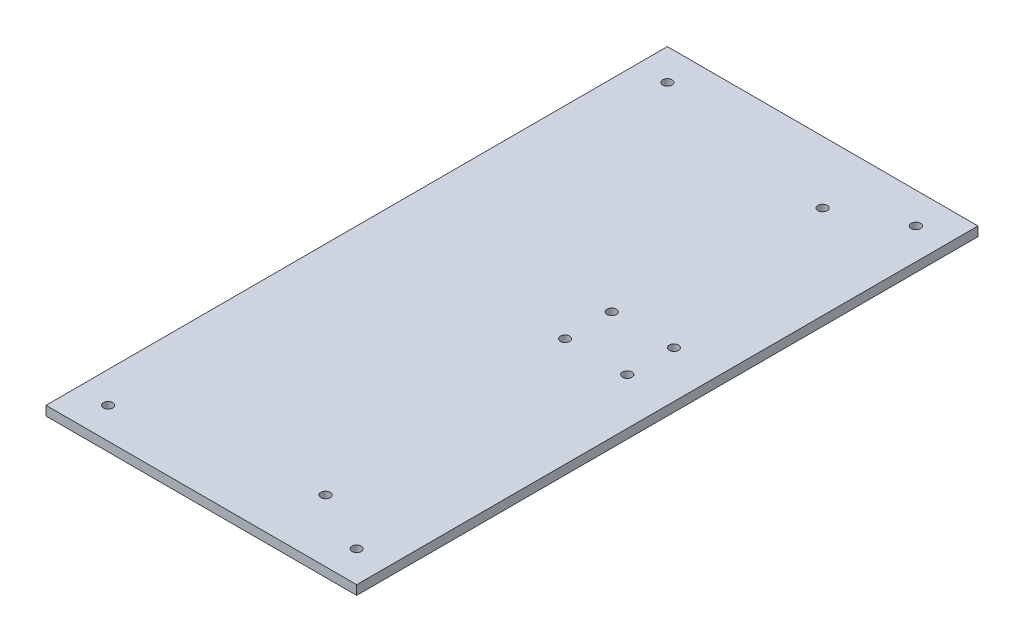
ISO-10303-21;
HEADER;
FILE_DESCRIPTION(('STEP AP214'),'2;1');
FILE_NAME('part.step','',(''),(''),'','','');
FILE_SCHEMA(('AUTOMOTIVE_DESIGN { 1 0 10303 214 1 1 1 1 }'));
ENDSEC;
DATA;
#1=APPLICATION_CONTEXT('core data for automotive mechanical design processes');
#2=APPLICATION_PROTOCOL_DEFINITION('international standard','automotive_design',2000,#1);
#3=PRODUCT_CONTEXT('',#1,'mechanical');
#4=PRODUCT('Part','Part','',(#3));
#5=PRODUCT_RELATED_PRODUCT_CATEGORY('part','',(#4));
#6=PRODUCT_DEFINITION_FORMATION('','',#4);
#7=PRODUCT_DEFINITION_CONTEXT('part definition',#1,'design');
#8=PRODUCT_DEFINITION('design','',#6,#7);
#9=PRODUCT_DEFINITION_SHAPE('','',#8);
#10=(LENGTH_UNIT() NAMED_UNIT(*) SI_UNIT(.MILLI.,.METRE.));
#11=(NAMED_UNIT(*) PLANE_ANGLE_UNIT() SI_UNIT($,.RADIAN.));
#12=(NAMED_UNIT(*) SI_UNIT($,.STERADIAN.) SOLID_ANGLE_UNIT());
#13=UNCERTAINTY_MEASURE_WITH_UNIT(LENGTH_MEASURE(1.E-05),#10,'distance_accuracy_value','');
#14=(GEOMETRIC_REPRESENTATION_CONTEXT(3) GLOBAL_UNCERTAINTY_ASSIGNED_CONTEXT((#13)) GLOBAL_UNIT_ASSIGNED_CONTEXT((#10,
#11,#12)) REPRESENTATION_CONTEXT('',''));
#15=CARTESIAN_POINT('',(0.,0.,0.));
#16=DIRECTION('',(0.,0.,1.));
#17=DIRECTION('',(1.,0.,0.));
#18=AXIS2_PLACEMENT_3D('',#15,#16,#17);
#19=CARTESIAN_POINT('',(-50.,3.,100.));
#20=DIRECTION('',(1.,0.,0.));
#21=DIRECTION('',(0.,0.,-1.));
#22=AXIS2_PLACEMENT_3D('',#19,#20,#21);
#23=PLANE('',#22);
#24=DIRECTION('',(0.,0.,1.));
#25=VECTOR('',#24,1.);
#26=CARTESIAN_POINT('',(-50.,0.,100.));
#27=LINE('',#26,#25);
#28=CARTESIAN_POINT('',(-50.,0.,-100.));
#29=VERTEX_POINT('',#28);
#30=CARTESIAN_POINT('',(-50.,0.,100.));
#31=VERTEX_POINT('',#30);
#32=EDGE_CURVE('E100',#29,#31,#27,.T.);
#33=ORIENTED_EDGE('',*,*,#32,.T.);
#34=DIRECTION('',(0.,-1.,0.));
#35=VECTOR('',#34,1.);
#36=CARTESIAN_POINT('',(-50.,3.,100.));
#37=LINE('',#36,#35);
#38=CARTESIAN_POINT('',(-50.,3.,100.));
#39=VERTEX_POINT('',#38);
#40=EDGE_CURVE('E11',#39,#31,#37,.T.);
#41=ORIENTED_EDGE('',*,*,#40,.F.);
#42=DIRECTION('',(0.,0.,1.));
#43=VECTOR('',#42,1.);
#44=CARTESIAN_POINT('',(-50.,3.,100.));
#45=LINE('',#44,#43);
#46=CARTESIAN_POINT('',(-50.,3.,-100.));
#47=VERTEX_POINT('',#46);
#48=EDGE_CURVE('E87',#47,#39,#45,.T.);
#49=ORIENTED_EDGE('',*,*,#48,.F.);
#50=DIRECTION('',(0.,-1.,0.));
#51=VECTOR('',#50,1.);
#52=CARTESIAN_POINT('',(-50.,3.,-100.));
#53=LINE('',#52,#51);
#54=EDGE_CURVE('E96',#47,#29,#53,.T.);
#55=ORIENTED_EDGE('',*,*,#54,.T.);
#56=EDGE_LOOP('',(#33,#41,#49,#55));
#57=FACE_BOUND('',#56,.T.);
#58=ADVANCED_FACE('F34',(#57),#23,.F.);
#59=CARTESIAN_POINT('',(50.,3.,100.));
#60=DIRECTION('',(0.,0.,-1.));
#61=DIRECTION('',(-1.,0.,0.));
#62=AXIS2_PLACEMENT_3D('',#59,#60,#61);
#63=PLANE('',#62);
#64=DIRECTION('',(1.,0.,0.));
#65=VECTOR('',#64,1.);
#66=CARTESIAN_POINT('',(50.,0.,100.));
#67=LINE('',#66,#65);
#68=CARTESIAN_POINT('',(50.,0.,100.));
#69=VERTEX_POINT('',#68);
#70=EDGE_CURVE('E91',#31,#69,#67,.T.);
#71=ORIENTED_EDGE('',*,*,#70,.T.);
#72=DIRECTION('',(0.,-1.,0.));
#73=VECTOR('',#72,1.);
#74=CARTESIAN_POINT('',(50.,3.,100.));
#75=LINE('',#74,#73);
#76=CARTESIAN_POINT('',(50.,3.,100.));
#77=VERTEX_POINT('',#76);
#78=EDGE_CURVE('E43',#77,#69,#75,.T.);
#79=ORIENTED_EDGE('',*,*,#78,.F.);
#80=DIRECTION('',(1.,0.,0.));
#81=VECTOR('',#80,1.);
#82=CARTESIAN_POINT('',(50.,3.,100.));
#83=LINE('',#82,#81);
#84=EDGE_CURVE('E82',#39,#77,#83,.T.);
#85=ORIENTED_EDGE('',*,*,#84,.F.);
#86=ORIENTED_EDGE('',*,*,#40,.T.);
#87=EDGE_LOOP('',(#71,#79,#85,#86));
#88=FACE_BOUND('',#87,.T.);
#89=ADVANCED_FACE('F90',(#88),#63,.F.);
#90=CARTESIAN_POINT('',(50.,3.,100.));
#91=DIRECTION('',(-1.,0.,0.));
#92=DIRECTION('',(0.,0.,1.));
#93=AXIS2_PLACEMENT_3D('',#90,#91,#92);
#94=PLANE('',#93);
#95=DIRECTION('',(0.,0.,-1.));
#96=VECTOR('',#95,1.);
#97=CARTESIAN_POINT('',(50.,0.,100.));
#98=LINE('',#97,#96);
#99=CARTESIAN_POINT('',(50.,0.,-100.));
#100=VERTEX_POINT('',#99);
#101=EDGE_CURVE('E69',#69,#100,#98,.T.);
#102=ORIENTED_EDGE('',*,*,#101,.T.);
#103=DIRECTION('',(0.,-1.,0.));
#104=VECTOR('',#103,1.);
#105=CARTESIAN_POINT('',(50.,3.,-100.));
#106=LINE('',#105,#104);
#107=CARTESIAN_POINT('',(50.,3.,-100.));
#108=VERTEX_POINT('',#107);
#109=EDGE_CURVE('E92',#108,#100,#106,.T.);
#110=ORIENTED_EDGE('',*,*,#109,.F.);
#111=DIRECTION('',(0.,0.,-1.));
#112=VECTOR('',#111,1.);
#113=CARTESIAN_POINT('',(50.,3.,100.));
#114=LINE('',#113,#112);
#115=EDGE_CURVE('E85',#77,#108,#114,.T.);
#116=ORIENTED_EDGE('',*,*,#115,.F.);
#117=ORIENTED_EDGE('',*,*,#78,.T.);
#118=EDGE_LOOP('',(#102,#110,#116,#117));
#119=FACE_BOUND('',#118,.T.);
#120=ADVANCED_FACE('F94',(#119),#94,.F.);
#121=CARTESIAN_POINT('',(50.,3.,-100.));
#122=DIRECTION('',(0.,0.,1.));
#123=DIRECTION('',(1.,0.,0.));
#124=AXIS2_PLACEMENT_3D('',#121,#122,#123);
#125=PLANE('',#124);
#126=DIRECTION('',(-1.,0.,0.));
#127=VECTOR('',#126,1.);
#128=CARTESIAN_POINT('',(50.,0.,-100.));
#129=LINE('',#128,#127);
#130=EDGE_CURVE('E75',#100,#29,#129,.T.);
#131=ORIENTED_EDGE('',*,*,#130,.T.);
#132=ORIENTED_EDGE('',*,*,#54,.F.);
#133=DIRECTION('',(-1.,0.,0.));
#134=VECTOR('',#133,1.);
#135=CARTESIAN_POINT('',(50.,3.,-100.));
#136=LINE('',#135,#134);
#137=EDGE_CURVE('E52',#108,#47,#136,.T.);
#138=ORIENTED_EDGE('',*,*,#137,.F.);
#139=ORIENTED_EDGE('',*,*,#109,.T.);
#140=EDGE_LOOP('',(#131,#132,#138,#139));
#141=FACE_BOUND('',#140,.T.);
#142=ADVANCED_FACE('F150',(#141),#125,.F.);
#143=CARTESIAN_POINT('',(0.,3.,0.));
#144=DIRECTION('',(0.,1.,0.));
#145=DIRECTION('',(0.,0.,1.));
#146=AXIS2_PLACEMENT_3D('',#143,#144,#145);
#147=PLANE('',#146);
#148=CARTESIAN_POINT('',(35.,3.,-2.09999999999999));
#149=DIRECTION('',(0.,1.,0.));
#150=DIRECTION('',(0.,0.,1.));
#151=AXIS2_PLACEMENT_3D('',#148,#149,#150);
#152=CIRCLE('',#151,1.5);
#153=CARTESIAN_POINT('',(35.,3.,-0.59999999999999));
#154=VERTEX_POINT('',#153);
#155=EDGE_CURVE('E296',#154,#154,#152,.T.);
#156=ORIENTED_EDGE('',*,*,#155,.F.);
#157=EDGE_LOOP('',(#156));
#158=FACE_BOUND('',#157,.T.);
#159=CARTESIAN_POINT('',(15.,3.,-17.1));
#160=DIRECTION('',(0.,1.,0.));
#161=DIRECTION('',(0.,0.,1.));
#162=AXIS2_PLACEMENT_3D('',#159,#160,#161);
#163=CIRCLE('',#162,1.5);
#164=CARTESIAN_POINT('',(15.,3.,-15.6));
#165=VERTEX_POINT('',#164);
#166=EDGE_CURVE('E298',#165,#165,#163,.T.);
#167=ORIENTED_EDGE('',*,*,#166,.F.);
#168=EDGE_LOOP('',(#167));
#169=FACE_BOUND('',#168,.T.);
#170=CARTESIAN_POINT('',(15.,3.,-2.09999999999999));
#171=DIRECTION('',(0.,1.,0.));
#172=DIRECTION('',(0.,0.,1.));
#173=AXIS2_PLACEMENT_3D('',#170,#171,#172);
#174=CIRCLE('',#173,1.5);
#175=CARTESIAN_POINT('',(15.,3.,-0.599999999999994));
#176=VERTEX_POINT('',#175);
#177=EDGE_CURVE('E304',#176,#176,#174,.T.);
#178=ORIENTED_EDGE('',*,*,#177,.F.);
#179=EDGE_LOOP('',(#178));
#180=FACE_BOUND('',#179,.T.);
#181=CARTESIAN_POINT('',(35.,3.,-17.1));
#182=DIRECTION('',(0.,1.,0.));
#183=DIRECTION('',(0.,0.,1.));
#184=AXIS2_PLACEMENT_3D('',#181,#182,#183);
#185=CIRCLE('',#184,1.5);
#186=CARTESIAN_POINT('',(35.,3.,-15.6));
#187=VERTEX_POINT('',#186);
#188=EDGE_CURVE('E310',#187,#187,#185,.T.);
#189=ORIENTED_EDGE('',*,*,#188,.F.);
#190=EDGE_LOOP('',(#189));
#191=FACE_BOUND('',#190,.T.);
#192=CARTESIAN_POINT('',(20.,3.,80.));
#193=DIRECTION('',(0.,1.,0.));
#194=DIRECTION('',(0.,0.,-1.));
#195=AXIS2_PLACEMENT_3D('',#192,#193,#194);
#196=CIRCLE('',#195,1.5);
#197=CARTESIAN_POINT('',(20.,3.,78.5));
#198=VERTEX_POINT('',#197);
#199=EDGE_CURVE('E122',#198,#198,#196,.T.);
#200=ORIENTED_EDGE('',*,*,#199,.F.);
#201=EDGE_LOOP('',(#200));
#202=FACE_BOUND('',#201,.T.);
#203=CARTESIAN_POINT('',(20.,3.,-80.));
#204=DIRECTION('',(0.,1.,0.));
#205=DIRECTION('',(0.,0.,1.));
#206=AXIS2_PLACEMENT_3D('',#203,#204,#205);
#207=CIRCLE('',#206,1.5);
#208=CARTESIAN_POINT('',(20.,3.,-78.5));
#209=VERTEX_POINT('',#208);
#210=EDGE_CURVE('E111',#209,#209,#207,.T.);
#211=ORIENTED_EDGE('',*,*,#210,.F.);
#212=EDGE_LOOP('',(#211));
#213=FACE_BOUND('',#212,.T.);
#214=CARTESIAN_POINT('',(-40.,3.,-90.));
#215=DIRECTION('',(0.,1.,0.));
#216=DIRECTION('',(0.,0.,-1.));
#217=AXIS2_PLACEMENT_3D('',#214,#215,#216);
#218=CIRCLE('',#217,1.5);
#219=CARTESIAN_POINT('',(-40.,3.,-91.5));
#220=VERTEX_POINT('',#219);
#221=EDGE_CURVE('E110',#220,#220,#218,.T.);
#222=ORIENTED_EDGE('',*,*,#221,.F.);
#223=EDGE_LOOP('',(#222));
#224=FACE_BOUND('',#223,.T.);
#225=CARTESIAN_POINT('',(40.,3.,-90.));
#226=DIRECTION('',(0.,1.,0.));
#227=DIRECTION('',(0.,0.,1.));
#228=AXIS2_PLACEMENT_3D('',#225,#226,#227);
#229=CIRCLE('',#228,1.5);
#230=CARTESIAN_POINT('',(40.,3.,-88.5));
#231=VERTEX_POINT('',#230);
#232=EDGE_CURVE('E127',#231,#231,#229,.T.);
#233=ORIENTED_EDGE('',*,*,#232,.F.);
#234=EDGE_LOOP('',(#233));
#235=FACE_BOUND('',#234,.T.);
#236=CARTESIAN_POINT('',(40.,3.,90.));
#237=DIRECTION('',(0.,1.,0.));
#238=DIRECTION('',(0.,0.,-1.));
#239=AXIS2_PLACEMENT_3D('',#236,#237,#238);
#240=CIRCLE('',#239,1.5);
#241=CARTESIAN_POINT('',(40.,3.,88.5));
#242=VERTEX_POINT('',#241);
#243=EDGE_CURVE('E132',#242,#242,#240,.T.);
#244=ORIENTED_EDGE('',*,*,#243,.F.);
#245=EDGE_LOOP('',(#244));
#246=FACE_BOUND('',#245,.T.);
#247=CARTESIAN_POINT('',(-40.,3.,90.));
#248=DIRECTION('',(0.,1.,0.));
#249=DIRECTION('',(0.,0.,1.));
#250=AXIS2_PLACEMENT_3D('',#247,#248,#249);
#251=CIRCLE('',#250,1.5);
#252=CARTESIAN_POINT('',(-40.,3.,91.5));
#253=VERTEX_POINT('',#252);
#254=EDGE_CURVE('E138',#253,#253,#251,.T.);
#255=ORIENTED_EDGE('',*,*,#254,.F.);
#256=EDGE_LOOP('',(#255));
#257=FACE_BOUND('',#256,.T.);
#258=ORIENTED_EDGE('',*,*,#48,.T.);
#259=ORIENTED_EDGE('',*,*,#84,.T.);
#260=ORIENTED_EDGE('',*,*,#115,.T.);
#261=ORIENTED_EDGE('',*,*,#137,.T.);
#262=EDGE_LOOP('',(#258,#259,#260,#261));
#263=FACE_BOUND('',#262,.T.);
#264=ADVANCED_FACE('F83',(#158,#169,#180,#191,#202,#213,#224,#235,#246,#257,#263),#147,.T.);
#265=CARTESIAN_POINT('',(0.,0.,0.));
#266=DIRECTION('',(0.,1.,0.));
#267=DIRECTION('',(0.,0.,1.));
#268=AXIS2_PLACEMENT_3D('',#265,#266,#267);
#269=PLANE('',#268);
#270=CARTESIAN_POINT('',(35.,0.,-2.09999999999999));
#271=DIRECTION('',(0.,1.,0.));
#272=DIRECTION('',(0.,0.,1.));
#273=AXIS2_PLACEMENT_3D('',#270,#271,#272);
#274=CIRCLE('',#273,1.5);
#275=CARTESIAN_POINT('',(35.,0.,-0.59999999999999));
#276=VERTEX_POINT('',#275);
#277=EDGE_CURVE('E294',#276,#276,#274,.T.);
#278=ORIENTED_EDGE('',*,*,#277,.T.);
#279=EDGE_LOOP('',(#278));
#280=FACE_BOUND('',#279,.T.);
#281=CARTESIAN_POINT('',(15.,0.,-17.1));
#282=DIRECTION('',(0.,1.,0.));
#283=DIRECTION('',(0.,0.,1.));
#284=AXIS2_PLACEMENT_3D('',#281,#282,#283);
#285=CIRCLE('',#284,1.5);
#286=CARTESIAN_POINT('',(15.,0.,-15.6));
#287=VERTEX_POINT('',#286);
#288=EDGE_CURVE('E301',#287,#287,#285,.T.);
#289=ORIENTED_EDGE('',*,*,#288,.T.);
#290=EDGE_LOOP('',(#289));
#291=FACE_BOUND('',#290,.T.);
#292=CARTESIAN_POINT('',(15.,0.,-2.09999999999999));
#293=DIRECTION('',(0.,1.,0.));
#294=DIRECTION('',(0.,0.,1.));
#295=AXIS2_PLACEMENT_3D('',#292,#293,#294);
#296=CIRCLE('',#295,1.5);
#297=CARTESIAN_POINT('',(15.,0.,-0.599999999999994));
#298=VERTEX_POINT('',#297);
#299=EDGE_CURVE('E307',#298,#298,#296,.T.);
#300=ORIENTED_EDGE('',*,*,#299,.T.);
#301=EDGE_LOOP('',(#300));
#302=FACE_BOUND('',#301,.T.);
#303=CARTESIAN_POINT('',(35.,0.,-17.1));
#304=DIRECTION('',(0.,1.,0.));
#305=DIRECTION('',(0.,0.,1.));
#306=AXIS2_PLACEMENT_3D('',#303,#304,#305);
#307=CIRCLE('',#306,1.5);
#308=CARTESIAN_POINT('',(35.,0.,-15.6));
#309=VERTEX_POINT('',#308);
#310=EDGE_CURVE('E313',#309,#309,#307,.T.);
#311=ORIENTED_EDGE('',*,*,#310,.T.);
#312=EDGE_LOOP('',(#311));
#313=FACE_BOUND('',#312,.T.);
#314=CARTESIAN_POINT('',(20.,0.,80.));
#315=DIRECTION('',(0.,1.,0.));
#316=DIRECTION('',(0.,0.,1.));
#317=AXIS2_PLACEMENT_3D('',#314,#315,#316);
#318=CIRCLE('',#317,1.5);
#319=CARTESIAN_POINT('',(20.,0.,81.5));
#320=VERTEX_POINT('',#319);
#321=EDGE_CURVE('E37',#320,#320,#318,.T.);
#322=ORIENTED_EDGE('',*,*,#321,.T.);
#323=EDGE_LOOP('',(#322));
#324=FACE_BOUND('',#323,.T.);
#325=CARTESIAN_POINT('',(20.,0.,-80.));
#326=DIRECTION('',(0.,1.,0.));
#327=DIRECTION('',(0.,0.,1.));
#328=AXIS2_PLACEMENT_3D('',#325,#326,#327);
#329=CIRCLE('',#328,1.5);
#330=CARTESIAN_POINT('',(20.,0.,-78.5));
#331=VERTEX_POINT('',#330);
#332=EDGE_CURVE('E108',#331,#331,#329,.T.);
#333=ORIENTED_EDGE('',*,*,#332,.T.);
#334=EDGE_LOOP('',(#333));
#335=FACE_BOUND('',#334,.T.);
#336=CARTESIAN_POINT('',(-40.,0.,-90.));
#337=DIRECTION('',(0.,1.,0.));
#338=DIRECTION('',(0.,0.,-1.));
#339=AXIS2_PLACEMENT_3D('',#336,#337,#338);
#340=CIRCLE('',#339,1.5);
#341=CARTESIAN_POINT('',(-40.,0.,-91.5));
#342=VERTEX_POINT('',#341);
#343=EDGE_CURVE('E115',#342,#342,#340,.T.);
#344=ORIENTED_EDGE('',*,*,#343,.T.);
#345=EDGE_LOOP('',(#344));
#346=FACE_BOUND('',#345,.T.);
#347=CARTESIAN_POINT('',(40.,0.,-90.));
#348=DIRECTION('',(0.,1.,0.));
#349=DIRECTION('',(0.,0.,1.));
#350=AXIS2_PLACEMENT_3D('',#347,#348,#349);
#351=CIRCLE('',#350,1.5);
#352=CARTESIAN_POINT('',(40.,0.,-88.5));
#353=VERTEX_POINT('',#352);
#354=EDGE_CURVE('E129',#353,#353,#351,.T.);
#355=ORIENTED_EDGE('',*,*,#354,.T.);
#356=EDGE_LOOP('',(#355));
#357=FACE_BOUND('',#356,.T.);
#358=CARTESIAN_POINT('',(40.,0.,90.));
#359=DIRECTION('',(0.,1.,0.));
#360=DIRECTION('',(0.,0.,-1.));
#361=AXIS2_PLACEMENT_3D('',#358,#359,#360);
#362=CIRCLE('',#361,1.5);
#363=CARTESIAN_POINT('',(40.,0.,88.5));
#364=VERTEX_POINT('',#363);
#365=EDGE_CURVE('E135',#364,#364,#362,.T.);
#366=ORIENTED_EDGE('',*,*,#365,.T.);
#367=EDGE_LOOP('',(#366));
#368=FACE_BOUND('',#367,.T.);
#369=CARTESIAN_POINT('',(-40.,0.,90.));
#370=DIRECTION('',(0.,1.,0.));
#371=DIRECTION('',(0.,0.,1.));
#372=AXIS2_PLACEMENT_3D('',#369,#370,#371);
#373=CIRCLE('',#372,1.5);
#374=CARTESIAN_POINT('',(-40.,0.,91.5));
#375=VERTEX_POINT('',#374);
#376=EDGE_CURVE('E103',#375,#375,#373,.T.);
#377=ORIENTED_EDGE('',*,*,#376,.T.);
#378=EDGE_LOOP('',(#377));
#379=FACE_BOUND('',#378,.T.);
#380=ORIENTED_EDGE('',*,*,#32,.F.);
#381=ORIENTED_EDGE('',*,*,#130,.F.);
#382=ORIENTED_EDGE('',*,*,#101,.F.);
#383=ORIENTED_EDGE('',*,*,#70,.F.);
#384=EDGE_LOOP('',(#380,#381,#382,#383));
#385=FACE_BOUND('',#384,.T.);
#386=ADVANCED_FACE('F149',(#280,#291,#302,#313,#324,#335,#346,#357,#368,#379,#385),#269,.F.);
#387=CARTESIAN_POINT('',(-40.,0.,90.));
#388=DIRECTION('',(0.,1.,0.));
#389=DIRECTION('',(0.,0.,1.));
#390=AXIS2_PLACEMENT_3D('',#387,#388,#389);
#391=CYLINDRICAL_SURFACE('',#390,1.5);
#392=ORIENTED_EDGE('',*,*,#376,.F.);
#393=EDGE_LOOP('',(#392));
#394=FACE_BOUND('',#393,.T.);
#395=ORIENTED_EDGE('',*,*,#254,.T.);
#396=EDGE_LOOP('',(#395));
#397=FACE_BOUND('',#396,.T.);
#398=ADVANCED_FACE('F146',(#394,#397),#391,.F.);
#399=CARTESIAN_POINT('',(40.,0.,90.));
#400=DIRECTION('',(0.,1.,0.));
#401=DIRECTION('',(0.,0.,1.));
#402=AXIS2_PLACEMENT_3D('',#399,#400,#401);
#403=CYLINDRICAL_SURFACE('',#402,1.5);
#404=ORIENTED_EDGE('',*,*,#365,.F.);
#405=EDGE_LOOP('',(#404));
#406=FACE_BOUND('',#405,.T.);
#407=ORIENTED_EDGE('',*,*,#243,.T.);
#408=EDGE_LOOP('',(#407));
#409=FACE_BOUND('',#408,.T.);
#410=ADVANCED_FACE('F190',(#406,#409),#403,.F.);
#411=CARTESIAN_POINT('',(40.,0.,-90.));
#412=DIRECTION('',(0.,1.,0.));
#413=DIRECTION('',(0.,0.,1.));
#414=AXIS2_PLACEMENT_3D('',#411,#412,#413);
#415=CYLINDRICAL_SURFACE('',#414,1.5);
#416=ORIENTED_EDGE('',*,*,#354,.F.);
#417=EDGE_LOOP('',(#416));
#418=FACE_BOUND('',#417,.T.);
#419=ORIENTED_EDGE('',*,*,#232,.T.);
#420=EDGE_LOOP('',(#419));
#421=FACE_BOUND('',#420,.T.);
#422=ADVANCED_FACE('F200',(#418,#421),#415,.F.);
#423=CARTESIAN_POINT('',(-40.,0.,-90.));
#424=DIRECTION('',(0.,1.,0.));
#425=DIRECTION('',(0.,0.,1.));
#426=AXIS2_PLACEMENT_3D('',#423,#424,#425);
#427=CYLINDRICAL_SURFACE('',#426,1.5);
#428=ORIENTED_EDGE('',*,*,#343,.F.);
#429=EDGE_LOOP('',(#428));
#430=FACE_BOUND('',#429,.T.);
#431=ORIENTED_EDGE('',*,*,#221,.T.);
#432=EDGE_LOOP('',(#431));
#433=FACE_BOUND('',#432,.T.);
#434=ADVANCED_FACE('F210',(#430,#433),#427,.F.);
#435=CARTESIAN_POINT('',(20.,-22.,-80.));
#436=DIRECTION('',(0.,1.,0.));
#437=DIRECTION('',(0.,0.,1.));
#438=AXIS2_PLACEMENT_3D('',#435,#436,#437);
#439=CYLINDRICAL_SURFACE('',#438,1.5);
#440=ORIENTED_EDGE('',*,*,#210,.T.);
#441=EDGE_LOOP('',(#440));
#442=FACE_BOUND('',#441,.T.);
#443=ORIENTED_EDGE('',*,*,#332,.F.);
#444=EDGE_LOOP('',(#443));
#445=FACE_BOUND('',#444,.T.);
#446=ADVANCED_FACE('F220',(#442,#445),#439,.F.);
#447=CARTESIAN_POINT('',(20.,-22.,80.));
#448=DIRECTION('',(0.,1.,0.));
#449=DIRECTION('',(0.,0.,1.));
#450=AXIS2_PLACEMENT_3D('',#447,#448,#449);
#451=CYLINDRICAL_SURFACE('',#450,1.5);
#452=ORIENTED_EDGE('',*,*,#199,.T.);
#453=EDGE_LOOP('',(#452));
#454=FACE_BOUND('',#453,.T.);
#455=ORIENTED_EDGE('',*,*,#321,.F.);
#456=EDGE_LOOP('',(#455));
#457=FACE_BOUND('',#456,.T.);
#458=ADVANCED_FACE('F230',(#454,#457),#451,.F.);
#459=CARTESIAN_POINT('',(35.,0.,-17.1));
#460=DIRECTION('',(0.,1.,0.));
#461=DIRECTION('',(0.,0.,1.));
#462=AXIS2_PLACEMENT_3D('',#459,#460,#461);
#463=CYLINDRICAL_SURFACE('',#462,1.5);
#464=ORIENTED_EDGE('',*,*,#310,.F.);
#465=EDGE_LOOP('',(#464));
#466=FACE_BOUND('',#465,.T.);
#467=ORIENTED_EDGE('',*,*,#188,.T.);
#468=EDGE_LOOP('',(#467));
#469=FACE_BOUND('',#468,.T.);
#470=ADVANCED_FACE('F238',(#466,#469),#463,.F.);
#471=CARTESIAN_POINT('',(15.,0.,-2.09999999999999));
#472=DIRECTION('',(0.,1.,0.));
#473=DIRECTION('',(0.,0.,1.));
#474=AXIS2_PLACEMENT_3D('',#471,#472,#473);
#475=CYLINDRICAL_SURFACE('',#474,1.5);
#476=ORIENTED_EDGE('',*,*,#299,.F.);
#477=EDGE_LOOP('',(#476));
#478=FACE_BOUND('',#477,.T.);
#479=ORIENTED_EDGE('',*,*,#177,.T.);
#480=EDGE_LOOP('',(#479));
#481=FACE_BOUND('',#480,.T.);
#482=ADVANCED_FACE('F257',(#478,#481),#475,.F.);
#483=CARTESIAN_POINT('',(15.,0.,-17.1));
#484=DIRECTION('',(0.,1.,0.));
#485=DIRECTION('',(0.,0.,1.));
#486=AXIS2_PLACEMENT_3D('',#483,#484,#485);
#487=CYLINDRICAL_SURFACE('',#486,1.5);
#488=ORIENTED_EDGE('',*,*,#288,.F.);
#489=EDGE_LOOP('',(#488));
#490=FACE_BOUND('',#489,.T.);
#491=ORIENTED_EDGE('',*,*,#166,.T.);
#492=EDGE_LOOP('',(#491));
#493=FACE_BOUND('',#492,.T.);
#494=ADVANCED_FACE('F267',(#490,#493),#487,.F.);
#495=CARTESIAN_POINT('',(35.,0.,-2.09999999999999));
#496=DIRECTION('',(0.,1.,0.));
#497=DIRECTION('',(0.,0.,1.));
#498=AXIS2_PLACEMENT_3D('',#495,#496,#497);
#499=CYLINDRICAL_SURFACE('',#498,1.5);
#500=ORIENTED_EDGE('',*,*,#277,.F.);
#501=EDGE_LOOP('',(#500));
#502=FACE_BOUND('',#501,.T.);
#503=ORIENTED_EDGE('',*,*,#155,.T.);
#504=EDGE_LOOP('',(#503));
#505=FACE_BOUND('',#504,.T.);
#506=ADVANCED_FACE('F277',(#502,#505),#499,.F.);
#507=CLOSED_SHELL('',(#58,#89,#120,#142,#264,#386,#398,#410,#422,#434,#446,#458,#470,#482,#494,#506));
#508=MANIFOLD_SOLID_BREP('B2',#507);
#509=ADVANCED_BREP_SHAPE_REPRESENTATION('',(#18,#508),#14);
#510=SHAPE_DEFINITION_REPRESENTATION(#9,#509);
ENDSEC;
END-ISO-10303-21;
